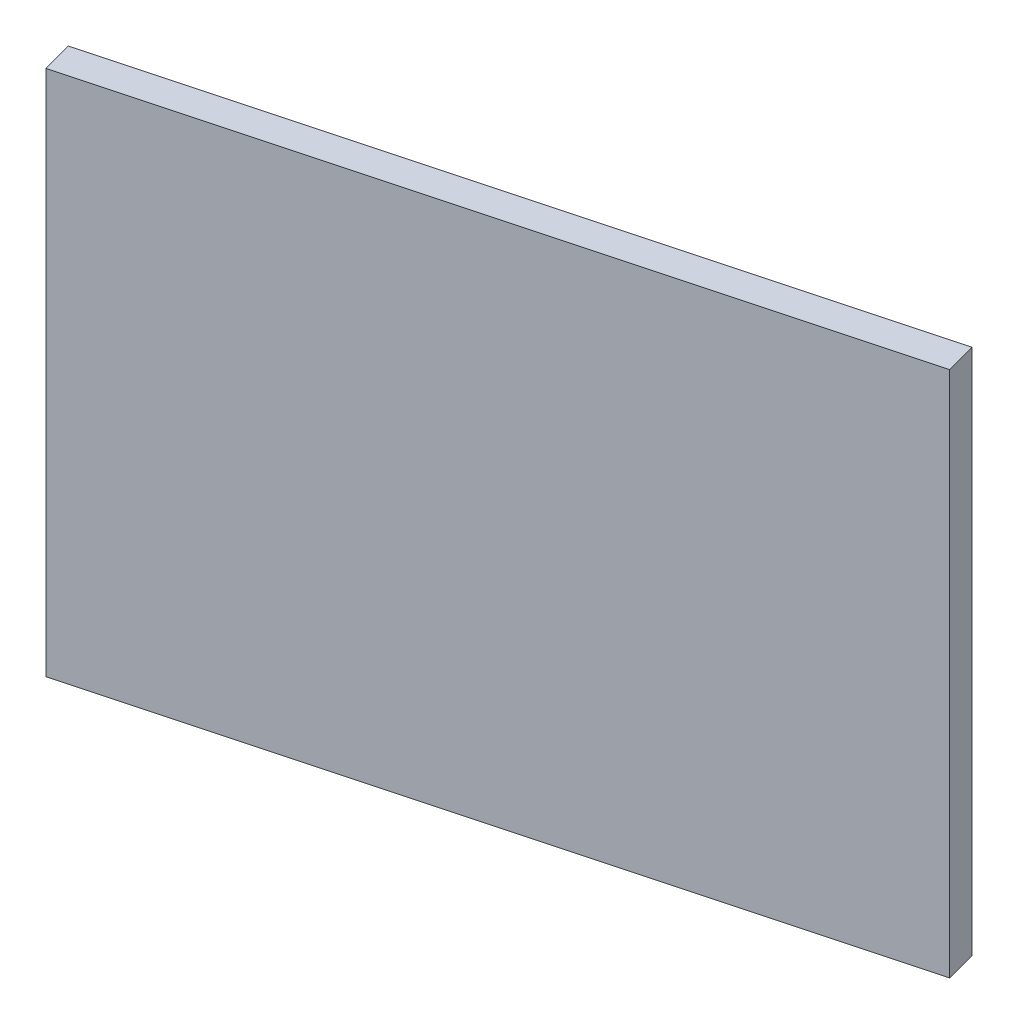
ISO-10303-21;
HEADER;
FILE_DESCRIPTION(('STEP AP214'),'2;1');
FILE_NAME('part.step','',(''),(''),'','','');
FILE_SCHEMA(('AUTOMOTIVE_DESIGN { 1 0 10303 214 1 1 1 1 }'));
ENDSEC;
DATA;
#1=APPLICATION_CONTEXT('core data for automotive mechanical design processes');
#2=APPLICATION_PROTOCOL_DEFINITION('international standard','automotive_design',2000,#1);
#3=PRODUCT_CONTEXT('',#1,'mechanical');
#4=PRODUCT('Part','Part','',(#3));
#5=PRODUCT_RELATED_PRODUCT_CATEGORY('part','',(#4));
#6=PRODUCT_DEFINITION_FORMATION('','',#4);
#7=PRODUCT_DEFINITION_CONTEXT('part definition',#1,'design');
#8=PRODUCT_DEFINITION('design','',#6,#7);
#9=PRODUCT_DEFINITION_SHAPE('','',#8);
#10=(LENGTH_UNIT() NAMED_UNIT(*) SI_UNIT(.MILLI.,.METRE.));
#11=(NAMED_UNIT(*) PLANE_ANGLE_UNIT() SI_UNIT($,.RADIAN.));
#12=(NAMED_UNIT(*) SI_UNIT($,.STERADIAN.) SOLID_ANGLE_UNIT());
#13=UNCERTAINTY_MEASURE_WITH_UNIT(LENGTH_MEASURE(1.E-05),#10,'distance_accuracy_value','');
#14=(GEOMETRIC_REPRESENTATION_CONTEXT(3) GLOBAL_UNCERTAINTY_ASSIGNED_CONTEXT((#13)) GLOBAL_UNIT_ASSIGNED_CONTEXT((#10,
#11,#12)) REPRESENTATION_CONTEXT('',''));
#15=CARTESIAN_POINT('',(0.,0.,0.));
#16=DIRECTION('',(0.,0.,1.));
#17=DIRECTION('',(1.,0.,0.));
#18=AXIS2_PLACEMENT_3D('',#15,#16,#17);
#19=CARTESIAN_POINT('',(1501.552914271,1721.,2409.583897875));
#20=DIRECTION('',(0.258819045102985,0.,0.965925826288944));
#21=DIRECTION('',(0.,-1.,0.));
#22=AXIS2_PLACEMENT_3D('',#19,#20,#21);
#23=PLANE('',#22);
#24=DIRECTION('',(0.965925826288944,0.,-0.258819045102985));
#25=VECTOR('',#24,1.);
#26=CARTESIAN_POINT('',(1433.93810643,1671.,2427.701231032));
#27=LINE('',#26,#25);
#28=CARTESIAN_POINT('',(1433.93810643,1671.,2427.701231032));
#29=VERTEX_POINT('',#28);
#30=CARTESIAN_POINT('',(1569.167722111,1671.,2391.466564718));
#31=VERTEX_POINT('',#30);
#32=EDGE_CURVE('E81',#29,#31,#27,.T.);
#33=ORIENTED_EDGE('',*,*,#32,.T.);
#34=DIRECTION('',(0.,1.,0.));
#35=VECTOR('',#34,1.);
#36=CARTESIAN_POINT('',(1569.167722111,1671.,2391.466564718));
#37=LINE('',#36,#35);
#38=CARTESIAN_POINT('',(1569.167722111,1771.,2391.466564718));
#39=VERTEX_POINT('',#38);
#40=EDGE_CURVE('E102',#31,#39,#37,.T.);
#41=ORIENTED_EDGE('',*,*,#40,.T.);
#42=DIRECTION('',(-0.965925826288944,0.,0.258819045102985));
#43=VECTOR('',#42,1.);
#44=CARTESIAN_POINT('',(1569.167722111,1771.,2391.466564718));
#45=LINE('',#44,#43);
#46=CARTESIAN_POINT('',(1433.93810643,1771.,2427.701231032));
#47=VERTEX_POINT('',#46);
#48=EDGE_CURVE('E74',#39,#47,#45,.T.);
#49=ORIENTED_EDGE('',*,*,#48,.T.);
#50=DIRECTION('',(0.,-1.,0.));
#51=VECTOR('',#50,1.);
#52=CARTESIAN_POINT('',(1433.93810643,1771.,2427.701231032));
#53=LINE('',#52,#51);
#54=EDGE_CURVE('E10',#47,#29,#53,.T.);
#55=ORIENTED_EDGE('',*,*,#54,.T.);
#56=EDGE_LOOP('',(#33,#41,#49,#55));
#57=FACE_BOUND('',#56,.T.);
#58=ADVANCED_FACE('F16',(#57),#23,.T.);
#59=CARTESIAN_POINT('',(1500.,1721.,2403.788342918));
#60=DIRECTION('',(0.258819045102985,0.,0.965925826288944));
#61=DIRECTION('',(0.,-1.,0.));
#62=AXIS2_PLACEMENT_3D('',#59,#60,#61);
#63=PLANE('',#62);
#64=DIRECTION('',(0.,-1.,0.));
#65=VECTOR('',#64,1.);
#66=CARTESIAN_POINT('',(1432.38519216,1771.,2421.905676075));
#67=LINE('',#66,#65);
#68=CARTESIAN_POINT('',(1432.38519216,1771.,2421.905676075));
#69=VERTEX_POINT('',#68);
#70=CARTESIAN_POINT('',(1432.38519216,1671.,2421.905676075));
#71=VERTEX_POINT('',#70);
#72=EDGE_CURVE('E25',#69,#71,#67,.T.);
#73=ORIENTED_EDGE('',*,*,#72,.F.);
#74=DIRECTION('',(-0.965925826288944,0.,0.258819045102985));
#75=VECTOR('',#74,1.);
#76=CARTESIAN_POINT('',(1567.61480784,1771.,2385.67100976));
#77=LINE('',#76,#75);
#78=CARTESIAN_POINT('',(1567.61480784,1771.,2385.67100976));
#79=VERTEX_POINT('',#78);
#80=EDGE_CURVE('E97',#79,#69,#77,.T.);
#81=ORIENTED_EDGE('',*,*,#80,.F.);
#82=DIRECTION('',(0.,1.,0.));
#83=VECTOR('',#82,1.);
#84=CARTESIAN_POINT('',(1567.61480784,1671.,2385.67100976));
#85=LINE('',#84,#83);
#86=CARTESIAN_POINT('',(1567.61480784,1671.,2385.67100976));
#87=VERTEX_POINT('',#86);
#88=EDGE_CURVE('E83',#87,#79,#85,.T.);
#89=ORIENTED_EDGE('',*,*,#88,.F.);
#90=DIRECTION('',(0.965925826288944,0.,-0.258819045102985));
#91=VECTOR('',#90,1.);
#92=CARTESIAN_POINT('',(1432.38519216,1671.,2421.905676075));
#93=LINE('',#92,#91);
#94=EDGE_CURVE('E79',#71,#87,#93,.T.);
#95=ORIENTED_EDGE('',*,*,#94,.F.);
#96=EDGE_LOOP('',(#73,#81,#89,#95));
#97=FACE_BOUND('',#96,.T.);
#98=ADVANCED_FACE('F18',(#97),#63,.F.);
#99=CARTESIAN_POINT('',(1432.38519216,1771.,2421.905676075));
#100=DIRECTION('',(0.965925826288944,0.,-0.258819045102985));
#101=DIRECTION('',(0.,-1.,0.));
#102=AXIS2_PLACEMENT_3D('',#99,#100,#101);
#103=PLANE('',#102);
#104=ORIENTED_EDGE('',*,*,#72,.T.);
#105=DIRECTION('',(0.258819045102985,0.,0.965925826288944));
#106=VECTOR('',#105,1.);
#107=CARTESIAN_POINT('',(1432.38519216,1671.,2421.905676075));
#108=LINE('',#107,#106);
#109=EDGE_CURVE('E68',#71,#29,#108,.T.);
#110=ORIENTED_EDGE('',*,*,#109,.T.);
#111=ORIENTED_EDGE('',*,*,#54,.F.);
#112=DIRECTION('',(0.258819045102985,0.,0.965925826288944));
#113=VECTOR('',#112,1.);
#114=CARTESIAN_POINT('',(1432.38519216,1771.,2421.905676075));
#115=LINE('',#114,#113);
#116=EDGE_CURVE('E71',#69,#47,#115,.T.);
#117=ORIENTED_EDGE('',*,*,#116,.F.);
#118=EDGE_LOOP('',(#104,#110,#111,#117));
#119=FACE_BOUND('',#118,.T.);
#120=ADVANCED_FACE('F67',(#119),#103,.F.);
#121=CARTESIAN_POINT('',(1567.61480784,1771.,2385.67100976));
#122=DIRECTION('',(0.,-1.,0.));
#123=DIRECTION('',(0.,0.,-1.));
#124=AXIS2_PLACEMENT_3D('',#121,#122,#123);
#125=PLANE('',#124);
#126=ORIENTED_EDGE('',*,*,#80,.T.);
#127=ORIENTED_EDGE('',*,*,#116,.T.);
#128=ORIENTED_EDGE('',*,*,#48,.F.);
#129=DIRECTION('',(0.258819045102985,0.,0.965925826288944));
#130=VECTOR('',#129,1.);
#131=CARTESIAN_POINT('',(1567.61480784,1771.,2385.67100976));
#132=LINE('',#131,#130);
#133=EDGE_CURVE('E98',#79,#39,#132,.T.);
#134=ORIENTED_EDGE('',*,*,#133,.F.);
#135=EDGE_LOOP('',(#126,#127,#128,#134));
#136=FACE_BOUND('',#135,.T.);
#137=ADVANCED_FACE('F116',(#136),#125,.F.);
#138=CARTESIAN_POINT('',(1567.61480784,1671.,2385.67100976));
#139=DIRECTION('',(-0.965925826288944,0.,0.258819045102985));
#140=DIRECTION('',(0.,1.,0.));
#141=AXIS2_PLACEMENT_3D('',#138,#139,#140);
#142=PLANE('',#141);
#143=ORIENTED_EDGE('',*,*,#88,.T.);
#144=ORIENTED_EDGE('',*,*,#133,.T.);
#145=ORIENTED_EDGE('',*,*,#40,.F.);
#146=DIRECTION('',(0.258819045102985,0.,0.965925826288944));
#147=VECTOR('',#146,1.);
#148=CARTESIAN_POINT('',(1567.61480784,1671.,2385.67100976));
#149=LINE('',#148,#147);
#150=EDGE_CURVE('E88',#87,#31,#149,.T.);
#151=ORIENTED_EDGE('',*,*,#150,.F.);
#152=EDGE_LOOP('',(#143,#144,#145,#151));
#153=FACE_BOUND('',#152,.T.);
#154=ADVANCED_FACE('F121',(#153),#142,.F.);
#155=CARTESIAN_POINT('',(1432.38519216,1671.,2421.905676075));
#156=DIRECTION('',(0.,1.,0.));
#157=DIRECTION('',(1.,0.,0.));
#158=AXIS2_PLACEMENT_3D('',#155,#156,#157);
#159=PLANE('',#158);
#160=ORIENTED_EDGE('',*,*,#94,.T.);
#161=ORIENTED_EDGE('',*,*,#150,.T.);
#162=ORIENTED_EDGE('',*,*,#32,.F.);
#163=ORIENTED_EDGE('',*,*,#109,.F.);
#164=EDGE_LOOP('',(#160,#161,#162,#163));
#165=FACE_BOUND('',#164,.T.);
#166=ADVANCED_FACE('F77',(#165),#159,.F.);
#167=CLOSED_SHELL('',(#58,#98,#120,#137,#154,#166));
#168=MANIFOLD_SOLID_BREP('B1',#167);
#169=ADVANCED_BREP_SHAPE_REPRESENTATION('',(#18,#168),#14);
#170=SHAPE_DEFINITION_REPRESENTATION(#9,#169);
ENDSEC;
END-ISO-10303-21;
